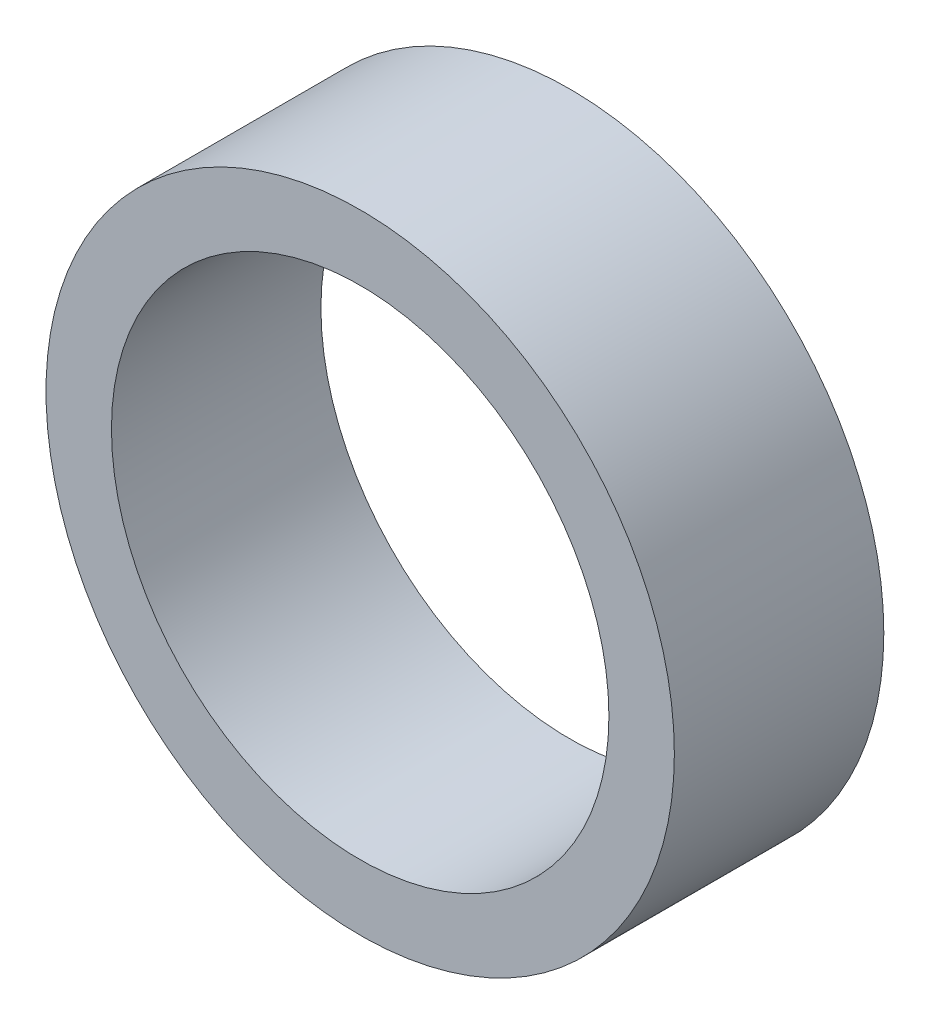
ISO-10303-21;
HEADER;
FILE_DESCRIPTION(('STEP AP214'),'2;1');
FILE_NAME('part.step','',(''),(''),'','','');
FILE_SCHEMA(('AUTOMOTIVE_DESIGN { 1 0 10303 214 1 1 1 1 }'));
ENDSEC;
DATA;
#1=APPLICATION_CONTEXT('core data for automotive mechanical design processes');
#2=APPLICATION_PROTOCOL_DEFINITION('international standard','automotive_design',2000,#1);
#3=PRODUCT_CONTEXT('',#1,'mechanical');
#4=PRODUCT('Part','Part','',(#3));
#5=PRODUCT_RELATED_PRODUCT_CATEGORY('part','',(#4));
#6=PRODUCT_DEFINITION_FORMATION('','',#4);
#7=PRODUCT_DEFINITION_CONTEXT('part definition',#1,'design');
#8=PRODUCT_DEFINITION('design','',#6,#7);
#9=PRODUCT_DEFINITION_SHAPE('','',#8);
#10=(LENGTH_UNIT() NAMED_UNIT(*) SI_UNIT(.MILLI.,.METRE.));
#11=(NAMED_UNIT(*) PLANE_ANGLE_UNIT() SI_UNIT($,.RADIAN.));
#12=(NAMED_UNIT(*) SI_UNIT($,.STERADIAN.) SOLID_ANGLE_UNIT());
#13=UNCERTAINTY_MEASURE_WITH_UNIT(LENGTH_MEASURE(1.E-05),#10,'distance_accuracy_value','');
#14=(GEOMETRIC_REPRESENTATION_CONTEXT(3) GLOBAL_UNCERTAINTY_ASSIGNED_CONTEXT((#13)) GLOBAL_UNIT_ASSIGNED_CONTEXT((#10,
#11,#12)) REPRESENTATION_CONTEXT('',''));
#15=CARTESIAN_POINT('',(0.,0.,0.));
#16=DIRECTION('',(0.,0.,1.));
#17=DIRECTION('',(1.,0.,0.));
#18=AXIS2_PLACEMENT_3D('',#15,#16,#17);
#19=CARTESIAN_POINT('',(0.,0.,3.175));
#20=DIRECTION('',(0.,0.,1.));
#21=DIRECTION('',(1.,0.,0.));
#22=AXIS2_PLACEMENT_3D('',#19,#20,#21);
#23=PLANE('',#22);
#24=CARTESIAN_POINT('',(0.,0.,3.175));
#25=DIRECTION('',(0.,0.,1.));
#26=DIRECTION('',(1.,0.,0.));
#27=AXIS2_PLACEMENT_3D('',#24,#25,#26);
#28=CIRCLE('',#27,9.525);
#29=CARTESIAN_POINT('',(9.525,0.,3.175));
#30=VERTEX_POINT('',#29);
#31=EDGE_CURVE('E10',#30,#30,#28,.T.);
#32=ORIENTED_EDGE('',*,*,#31,.T.);
#33=EDGE_LOOP('',(#32));
#34=FACE_BOUND('',#33,.T.);
#35=CARTESIAN_POINT('',(0.,0.,3.175));
#36=DIRECTION('',(0.,0.,1.));
#37=DIRECTION('',(1.,0.,0.));
#38=AXIS2_PLACEMENT_3D('',#35,#36,#37);
#39=CIRCLE('',#38,7.540625);
#40=CARTESIAN_POINT('',(7.540625,0.,3.175));
#41=VERTEX_POINT('',#40);
#42=EDGE_CURVE('E41',#41,#41,#39,.T.);
#43=ORIENTED_EDGE('',*,*,#42,.F.);
#44=EDGE_LOOP('',(#43));
#45=FACE_BOUND('',#44,.T.);
#46=ADVANCED_FACE('F30',(#34,#45),#23,.T.);
#47=CARTESIAN_POINT('',(0.,0.,-3.175));
#48=DIRECTION('',(0.,0.,1.));
#49=DIRECTION('',(1.,0.,0.));
#50=AXIS2_PLACEMENT_3D('',#47,#48,#49);
#51=PLANE('',#50);
#52=CARTESIAN_POINT('',(0.,0.,-3.175));
#53=DIRECTION('',(0.,0.,1.));
#54=DIRECTION('',(1.,0.,0.));
#55=AXIS2_PLACEMENT_3D('',#52,#53,#54);
#56=CIRCLE('',#55,9.525);
#57=CARTESIAN_POINT('',(9.525,0.,-3.175));
#58=VERTEX_POINT('',#57);
#59=EDGE_CURVE('E34',#58,#58,#56,.T.);
#60=ORIENTED_EDGE('',*,*,#59,.F.);
#61=EDGE_LOOP('',(#60));
#62=FACE_BOUND('',#61,.T.);
#63=CARTESIAN_POINT('',(0.,0.,-3.175));
#64=DIRECTION('',(0.,0.,1.));
#65=DIRECTION('',(1.,0.,0.));
#66=AXIS2_PLACEMENT_3D('',#63,#64,#65);
#67=CIRCLE('',#66,7.540625);
#68=CARTESIAN_POINT('',(7.540625,0.,-3.175));
#69=VERTEX_POINT('',#68);
#70=EDGE_CURVE('E43',#69,#69,#67,.T.);
#71=ORIENTED_EDGE('',*,*,#70,.T.);
#72=EDGE_LOOP('',(#71));
#73=FACE_BOUND('',#72,.T.);
#74=ADVANCED_FACE('F53',(#62,#73),#51,.F.);
#75=CARTESIAN_POINT('',(0.,0.,3.175));
#76=DIRECTION('',(0.,0.,-1.));
#77=DIRECTION('',(-1.,0.,0.));
#78=AXIS2_PLACEMENT_3D('',#75,#76,#77);
#79=CYLINDRICAL_SURFACE('',#78,9.525);
#80=ORIENTED_EDGE('',*,*,#31,.F.);
#81=EDGE_LOOP('',(#80));
#82=FACE_BOUND('',#81,.T.);
#83=ORIENTED_EDGE('',*,*,#59,.T.);
#84=EDGE_LOOP('',(#83));
#85=FACE_BOUND('',#84,.T.);
#86=ADVANCED_FACE('F32',(#82,#85),#79,.T.);
#87=CARTESIAN_POINT('',(0.,0.,3.175));
#88=DIRECTION('',(0.,0.,-1.));
#89=DIRECTION('',(-1.,0.,0.));
#90=AXIS2_PLACEMENT_3D('',#87,#88,#89);
#91=CYLINDRICAL_SURFACE('',#90,7.540625);
#92=ORIENTED_EDGE('',*,*,#42,.T.);
#93=EDGE_LOOP('',(#92));
#94=FACE_BOUND('',#93,.T.);
#95=ORIENTED_EDGE('',*,*,#70,.F.);
#96=EDGE_LOOP('',(#95));
#97=FACE_BOUND('',#96,.T.);
#98=ADVANCED_FACE('F49',(#94,#97),#91,.F.);
#99=CLOSED_SHELL('',(#46,#74,#86,#98));
#100=MANIFOLD_SOLID_BREP('B2',#99);
#101=ADVANCED_BREP_SHAPE_REPRESENTATION('',(#18,#100),#14);
#102=SHAPE_DEFINITION_REPRESENTATION(#9,#101);
ENDSEC;
END-ISO-10303-21;
